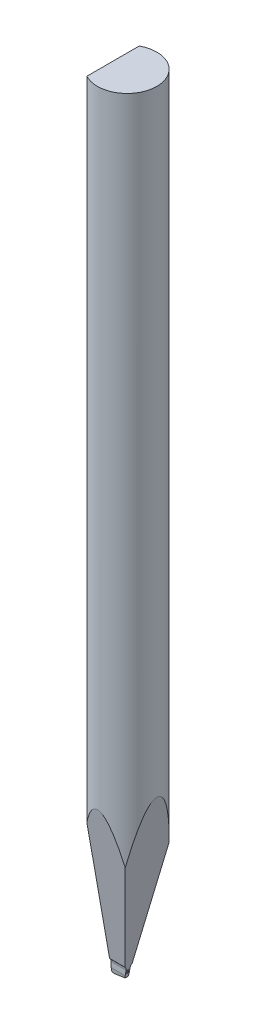
ISO-10303-21;
HEADER;
FILE_DESCRIPTION(('STEP AP214'),'2;1');
FILE_NAME('part.step','',(''),(''),'','','');
FILE_SCHEMA(('AUTOMOTIVE_DESIGN { 1 0 10303 214 1 1 1 1 }'));
ENDSEC;
DATA;
#1=APPLICATION_CONTEXT('core data for automotive mechanical design processes');
#2=APPLICATION_PROTOCOL_DEFINITION('international standard','automotive_design',2000,#1);
#3=PRODUCT_CONTEXT('',#1,'mechanical');
#4=PRODUCT('Part','Part','',(#3));
#5=PRODUCT_RELATED_PRODUCT_CATEGORY('part','',(#4));
#6=PRODUCT_DEFINITION_FORMATION('','',#4);
#7=PRODUCT_DEFINITION_CONTEXT('part definition',#1,'design');
#8=PRODUCT_DEFINITION('design','',#6,#7);
#9=PRODUCT_DEFINITION_SHAPE('','',#8);
#10=(LENGTH_UNIT() NAMED_UNIT(*) SI_UNIT(.MILLI.,.METRE.));
#11=(NAMED_UNIT(*) PLANE_ANGLE_UNIT() SI_UNIT($,.RADIAN.));
#12=(NAMED_UNIT(*) SI_UNIT($,.STERADIAN.) SOLID_ANGLE_UNIT());
#13=UNCERTAINTY_MEASURE_WITH_UNIT(LENGTH_MEASURE(1.E-05),#10,'distance_accuracy_value','');
#14=(GEOMETRIC_REPRESENTATION_CONTEXT(3) GLOBAL_UNCERTAINTY_ASSIGNED_CONTEXT((#13)) GLOBAL_UNIT_ASSIGNED_CONTEXT((#10,
#11,#12)) REPRESENTATION_CONTEXT('',''));
#15=CARTESIAN_POINT('',(0.,0.,0.));
#16=DIRECTION('',(0.,0.,1.));
#17=DIRECTION('',(1.,0.,0.));
#18=AXIS2_PLACEMENT_3D('',#15,#16,#17);
#19=CARTESIAN_POINT('',(-0.29972,0.,26.5186797019495));
#20=DIRECTION('',(-0.173648177666931,0.984807753012208,0.));
#21=DIRECTION('',(-0.984807753012208,-0.173648177666931,0.));
#22=AXIS2_PLACEMENT_3D('',#19,#20,#21);
#23=PLANE('',#22);
#24=DIRECTION('',(-0.984807753012208,-0.173648177666931,0.));
#25=VECTOR('',#24,1.);
#26=CARTESIAN_POINT('',(-0.29972,0.,0.0190499999999996));
#27=LINE('',#26,#25);
#28=CARTESIAN_POINT('',(-0.1397,0.0282158434529687,0.0190499999999998));
#29=VERTEX_POINT('',#28);
#30=CARTESIAN_POINT('',(-0.286429626386857,0.00234345145169317,0.01905));
#31=VERTEX_POINT('',#30);
#32=EDGE_CURVE('E220',#29,#31,#27,.T.);
#33=ORIENTED_EDGE('',*,*,#32,.F.);
#34=DIRECTION('',(0.,0.,1.));
#35=VECTOR('',#34,1.);
#36=CARTESIAN_POINT('',(-0.1397,0.0282158434529687,26.5186797019495));
#37=LINE('',#36,#35);
#38=CARTESIAN_POINT('',(-0.1397,0.0282158434529687,-0.0190499999999998));
#39=VERTEX_POINT('',#38);
#40=EDGE_CURVE('E11',#39,#29,#37,.T.);
#41=ORIENTED_EDGE('',*,*,#40,.F.);
#42=DIRECTION('',(-0.984807753012208,-0.173648177666931,0.));
#43=VECTOR('',#42,1.);
#44=CARTESIAN_POINT('',(-0.29972,0.,-0.0190499999999996));
#45=LINE('',#44,#43);
#46=CARTESIAN_POINT('',(-0.286429626386857,0.00234345145169317,-0.01905));
#47=VERTEX_POINT('',#46);
#48=EDGE_CURVE('E184',#39,#47,#45,.T.);
#49=ORIENTED_EDGE('',*,*,#48,.T.);
#50=CARTESIAN_POINT('',(-0.983960151536872,-0.12065,0.));
#51=DIRECTION('',(-0.173648177666931,0.984807753012208,0.));
#52=DIRECTION('',(-0.984807753012208,-0.173648177666931,0.));
#53=AXIS2_PLACEMENT_3D('',#50,#51,#52);
#54=ELLIPSE('',#53,0.716736574332053,0.12446);
#55=CARTESIAN_POINT('',(-0.299720000000004,0.,-0.0305196359577053));
#56=VERTEX_POINT('',#55);
#57=EDGE_CURVE('E262',#47,#56,#54,.T.);
#58=ORIENTED_EDGE('',*,*,#57,.T.);
#59=DIRECTION('',(0.984346441568213,0.173566836012845,-0.0306045161452665));
#60=VECTOR('',#59,1.);
#61=CARTESIAN_POINT('',(26.0298035813508,4.64260539659195,-0.849096592201888));
#62=LINE('',#61,#60);
#63=CARTESIAN_POINT('',(-0.0113543651851163,0.0508466417269895,-0.0394456348148853));
#64=VERTEX_POINT('',#63);
#65=EDGE_CURVE('E371',#56,#64,#62,.T.);
#66=ORIENTED_EDGE('',*,*,#65,.T.);
#67=DIRECTION('',(0.,0.,-1.));
#68=VECTOR('',#67,1.);
#69=CARTESIAN_POINT('',(-0.0113543651851151,0.0508466417269888,26.5186797019495));
#70=LINE('',#69,#68);
#71=CARTESIAN_POINT('',(-0.0113543651851163,0.0508466417269895,0.0394456348148853));
#72=VERTEX_POINT('',#71);
#73=EDGE_CURVE('E275',#72,#64,#70,.T.);
#74=ORIENTED_EDGE('',*,*,#73,.F.);
#75=DIRECTION('',(-0.984346441568213,-0.173566836012845,-0.0306045161452665));
#76=VECTOR('',#75,1.);
#77=CARTESIAN_POINT('',(26.0298035813508,4.64260539659195,0.849096592201888));
#78=LINE('',#77,#76);
#79=CARTESIAN_POINT('',(-0.299720000000002,0.,0.0305196359577053));
#80=VERTEX_POINT('',#79);
#81=EDGE_CURVE('E307',#72,#80,#78,.T.);
#82=ORIENTED_EDGE('',*,*,#81,.T.);
#83=EDGE_CURVE('E265',#80,#31,#54,.T.);
#84=ORIENTED_EDGE('',*,*,#83,.T.);
#85=EDGE_LOOP('',(#33,#41,#49,#58,#66,#74,#82,#84));
#86=FACE_BOUND('',#85,.T.);
#87=ADVANCED_FACE('F43',(#86),#23,.F.);
#88=CARTESIAN_POINT('',(26.8389469491216,-0.12065,0.));
#89=DIRECTION('',(-1.,0.,0.));
#90=DIRECTION('',(0.,0.,1.));
#91=AXIS2_PLACEMENT_3D('',#88,#89,#90);
#92=CYLINDRICAL_SURFACE('',#91,0.12446);
#93=DIRECTION('',(-1.,0.,0.));
#94=VECTOR('',#93,1.);
#95=CARTESIAN_POINT('',(26.8389469491216,0.00234345145169317,0.01905));
#96=LINE('',#95,#94);
#97=CARTESIAN_POINT('',(-0.301769962417407,0.00234345145169282,0.01905));
#98=VERTEX_POINT('',#97);
#99=EDGE_CURVE('E51',#31,#98,#96,.T.);
#100=ORIENTED_EDGE('',*,*,#99,.F.);
#101=ORIENTED_EDGE('',*,*,#83,.F.);
#102=CARTESIAN_POINT('',(-0.29972,0.,0.0305592719154106));
#103=DIRECTION('',(-1.,0.,0.));
#104=VECTOR('',#103,1.);
#105=LINE('',#102,#104);
#106=CARTESIAN_POINT('',(-0.347979999999999,0.,0.0305196359577053));
#107=VERTEX_POINT('',#106);
#108=EDGE_CURVE('E66',#80,#107,#105,.T.);
#109=ORIENTED_EDGE('',*,*,#108,.T.);
#110=CARTESIAN_POINT('',(-0.34798,0.,-0.0305592719154105));
#111=CARTESIAN_POINT('',(-0.348430814510365,-4.0790157401786E-07,-0.030560581386463));
#112=CARTESIAN_POINT('',(-0.348879913015498,1.08939864350477E-05,-0.0305162789202461));
#113=CARTESIAN_POINT('',(-0.349756979795945,5.32586660468888E-05,-0.0303484247483048));
#114=CARTESIAN_POINT('',(-0.350185131865885,8.40923596505527E-05,-0.0302257916828257));
#115=CARTESIAN_POINT('',(-0.351011762424045,0.000161841460247365,-0.0299134495677672));
#116=CARTESIAN_POINT('',(-0.351410362022562,0.000208686245204474,-0.0297240349657186));
#117=CARTESIAN_POINT('',(-0.352176540220128,0.000314247686217708,-0.0292915141713706));
#118=CARTESIAN_POINT('',(-0.352544019029949,0.000373000623512143,-0.0290482436791118));
#119=CARTESIAN_POINT('',(-0.353492609976714,0.000542464303570054,-0.0283352771344417));
#120=CARTESIAN_POINT('',(-0.354042823136011,0.000660718500816304,-0.0278264292093499));
#121=CARTESIAN_POINT('',(-0.355058485849617,0.000906480045085761,-0.0267326241717132));
#122=CARTESIAN_POINT('',(-0.355523692710971,0.00103401247561593,-0.0261474570746311));
#123=CARTESIAN_POINT('',(-0.356737267127974,0.00139509322037842,-0.024424665265501));
#124=CARTESIAN_POINT('',(-0.357402825120589,0.00162934905892421,-0.0232293596959535));
#125=CARTESIAN_POINT('',(-0.358560754617679,0.00207372872141576,-0.0207553925747807));
#126=CARTESIAN_POINT('',(-0.359052698197646,0.00228379206987497,-0.0194765341415885));
#127=CARTESIAN_POINT('',(-0.36030774701552,0.00284958434009851,-0.0156411550181883));
#128=CARTESIAN_POINT('',(-0.360888602450784,0.00315568845104849,-0.0130178775361172));
#129=CARTESIAN_POINT('',(-0.361706163735848,0.00360035199279706,-0.00770331230592785));
#130=CARTESIAN_POINT('',(-0.361941722221542,0.00373835258818556,-0.00501182791337141));
#131=CARTESIAN_POINT('',(-0.362122159422928,0.00384312710698266,0.000626307070904409));
#132=CARTESIAN_POINT('',(-0.362039043463169,0.00379341669557573,0.00357417277699146));
#133=CARTESIAN_POINT('',(-0.36150170314798,0.00348744188955353,0.00941520395438301));
#134=CARTESIAN_POINT('',(-0.361049465589899,0.0032322834184667,0.0123085776336631));
#135=CARTESIAN_POINT('',(-0.360101881253082,0.00276522394071858,0.0161243719322801));
#136=CARTESIAN_POINT('',(-0.359823561043634,0.00263206670724784,0.0171113029227183));
#137=CARTESIAN_POINT('',(-0.359191091592352,0.00234550293161942,0.0190622381461741));
#138=CARTESIAN_POINT('',(-0.358836664817193,0.00219202308727775,0.0200261437209395));
#139=CARTESIAN_POINT('',(-0.35792019094462,0.00182196264863964,0.0221910750494741));
#140=CARTESIAN_POINT('',(-0.35732773854375,0.00160009037378041,0.0233785738678838));
#141=CARTESIAN_POINT('',(-0.355941185679961,0.00114822728257018,0.0256274014231926));
#142=CARTESIAN_POINT('',(-0.35514861217987,0.000918308819136108,0.0266895999907303));
#143=CARTESIAN_POINT('',(-0.353869594547934,0.000625501592054897,0.027976474269296));
#144=CARTESIAN_POINT('',(-0.353498623594593,0.000547541257563668,0.0283116735867265));
#145=CARTESIAN_POINT('',(-0.352713845163361,0.000401035258663639,0.0289316105181223));
#146=CARTESIAN_POINT('',(-0.352300015965373,0.000332494409296592,0.0292163223453788));
#147=CARTESIAN_POINT('',(-0.35142414885153,0.000209524327572587,0.0297209697927657));
#148=CARTESIAN_POINT('',(-0.350961529273433,0.000155300800887052,0.0299399667559707));
#149=CARTESIAN_POINT('',(-0.350001496573154,6.91140443385488E-05,0.030285638001186));
#150=CARTESIAN_POINT('',(-0.349504228801302,3.70633361955864E-05,0.0304126751846489));
#151=CARTESIAN_POINT('',(-0.348830789757912,1.24370193427594E-05,0.0305101337557273));
#152=CARTESIAN_POINT('',(-0.348661251457123,7.78649892713723E-06,0.0305285162109277));
#153=CARTESIAN_POINT('',(-0.348321176485651,1.56788977353475E-06,0.0305530840375707));
#154=CARTESIAN_POINT('',(-0.348150639475355,9.18970805127776E-10,0.0305592649853819));
#155=CARTESIAN_POINT('',(-0.347980000000024,0.,0.0305592719155779));
#156=B_SPLINE_CURVE_WITH_KNOTS('',3,(#110,#111,#112,#113,#114,#115,#116,#117,#118,#119,#120,
#121,#122,#123,#124,#125,#126,#127,#128,#129,#130,#131,#132,#133,#134,#135,#136,#137,#138,#139,
#140,#141,#142,#143,#144,#145,#146,#147,#148,#149,#150,#151,#152,#153,#154,#155),.UNSPECIFIED.,
.F.,.F.,(4,2,2,2,2,2,2,2,2,2,2,2,2,2,2,2,2,2,2,2,2,2,4),(0.,0.00134741004079565,
0.00267930111383719,0.00400539168870872,0.00533558497102969,0.00759858100656418,
0.00986794025135302,0.0140085166125864,0.0181592285296514,0.0262271883927134,0.0343218964425103,
0.0431433167180924,0.0519175663828487,0.0550173321670425,0.0581285996977776,0.0621538633051677,
0.0661492954960546,0.0676639727026794,0.0691794213229861,0.0707155853403851,0.0722456536356855,
0.0727570681004673,0.0732686679434896),.UNSPECIFIED.);
#157=CARTESIAN_POINT('',(-0.347980000000002,0.,-0.030519635957705));
#158=VERTEX_POINT('',#157);
#159=EDGE_CURVE('E260',#158,#107,#156,.T.);
#160=ORIENTED_EDGE('',*,*,#159,.F.);
#161=CARTESIAN_POINT('',(-0.299720000000007,0.,-0.0304799999999999));
#162=DIRECTION('',(-1.,0.,0.));
#163=VECTOR('',#162,1.);
#164=LINE('',#161,#163);
#165=EDGE_CURVE('E331',#56,#158,#164,.T.);
#166=ORIENTED_EDGE('',*,*,#165,.F.);
#167=ORIENTED_EDGE('',*,*,#57,.F.);
#168=DIRECTION('',(-1.,0.,0.));
#169=VECTOR('',#168,1.);
#170=CARTESIAN_POINT('',(26.8389469491216,0.00234345145169317,-0.01905));
#171=LINE('',#170,#169);
#172=CARTESIAN_POINT('',(-0.301769962417407,0.00234345145169364,-0.01905));
#173=VERTEX_POINT('',#172);
#174=EDGE_CURVE('E266',#47,#173,#171,.T.);
#175=ORIENTED_EDGE('',*,*,#174,.T.);
#176=CARTESIAN_POINT('',(-0.301769962417407,0.00234345145169314,-0.01905));
#177=CARTESIAN_POINT('',(-0.303083212357795,0.00234273884135903,-0.0190505532683335));
#178=CARTESIAN_POINT('',(-0.304398530056794,0.00235919648592935,-0.0189481276282325));
#179=CARTESIAN_POINT('',(-0.307000954094572,0.00242318594032791,-0.0185302442706134));
#180=CARTESIAN_POINT('',(-0.308287873692993,0.00247088218091991,-0.0182136589885027));
#181=CARTESIAN_POINT('',(-0.310790852582439,0.00259423811870583,-0.0173587153989119));
#182=CARTESIAN_POINT('',(-0.312006641691863,0.00266999731654825,-0.0168195671794881));
#183=CARTESIAN_POINT('',(-0.314311894657055,0.00283986679158173,-0.015523243690556));
#184=CARTESIAN_POINT('',(-0.315401659849181,0.00293393178806268,-0.0147666042420507));
#185=CARTESIAN_POINT('',(-0.31730332104955,0.00311685645192294,-0.0131397171256992));
#186=CARTESIAN_POINT('',(-0.318132319467869,0.00320524260215012,-0.0122894206437063));
#187=CARTESIAN_POINT('',(-0.3196165652278,0.00337418177810725,-0.0104472759959153));
#188=CARTESIAN_POINT('',(-0.320271844381019,0.00345473623626944,-0.00945545379765719));
#189=CARTESIAN_POINT('',(-0.3213234426909,0.00358935319513246,-0.00746762605607109));
#190=CARTESIAN_POINT('',(-0.32173909228563,0.00364525831027112,-0.00648193686690554));
#191=CARTESIAN_POINT('',(-0.322389726393463,0.00373449435681656,-0.0044518189481206));
#192=CARTESIAN_POINT('',(-0.322624798676981,0.00376783625423748,-0.00340741902037943));
#193=CARTESIAN_POINT('',(-0.322897837996913,0.00380671319708877,-0.00134948273672548));
#194=CARTESIAN_POINT('',(-0.322945634936013,0.00381363450040313,-0.000337264641997512));
#195=CARTESIAN_POINT('',(-0.322869697716228,0.00380274111245844,0.00168052629893266));
#196=CARTESIAN_POINT('',(-0.322745983850237,0.00378492934757725,0.00268609991715538));
#197=CARTESIAN_POINT('',(-0.322334355344498,0.00372702254235129,0.0046473278957709));
#198=CARTESIAN_POINT('',(-0.322048793640665,0.00368724701865936,0.00560348787902325));
#199=CARTESIAN_POINT('',(-0.321324937242233,0.00358998817113897,0.00745501684823445));
#200=CARTESIAN_POINT('',(-0.320886639683836,0.00353250451528526,0.00835038469396416));
#201=CARTESIAN_POINT('',(-0.319862680839835,0.00340476764403495,0.0100730618825254));
#202=CARTESIAN_POINT('',(-0.319274533821476,0.00333430521919907,0.0108988749361181));
#203=CARTESIAN_POINT('',(-0.317974173980919,0.00318863460274331,0.0124454369952645));
#204=CARTESIAN_POINT('',(-0.317261944798882,0.00311342578616174,0.0131661721235828));
#205=CARTESIAN_POINT('',(-0.31569583062112,0.00296171888527247,0.0145232749481605));
#206=CARTESIAN_POINT('',(-0.314836555870207,0.00288535232362802,0.0151534243532859));
#207=CARTESIAN_POINT('',(-0.313030647680624,0.00274271134593144,0.0162742350252514));
#208=CARTESIAN_POINT('',(-0.312083969657596,0.00267644212671652,0.0167648245761543));
#209=CARTESIAN_POINT('',(-0.31004264333725,0.00255444746912226,0.0176399463518506));
#210=CARTESIAN_POINT('',(-0.308942302803632,0.00250016076595805,0.0180113663892418));
#211=CARTESIAN_POINT('',(-0.306698785837096,0.00241476087320615,0.0185861575843008));
#212=CARTESIAN_POINT('',(-0.305555627526932,0.00238363799331208,0.0187895990176943));
#213=CARTESIAN_POINT('',(-0.30352895790095,0.00235048998193052,0.0190043678177182));
#214=CARTESIAN_POINT('',(-0.302649080375743,0.00234326902739348,0.0190501179681685));
#215=CARTESIAN_POINT('',(-0.301769962417412,0.00234345145168755,0.0190500000000401));
#216=B_SPLINE_CURVE_WITH_KNOTS('',3,(#176,#177,#178,#179,#180,#181,#182,#183,#184,#185,#186,
#187,#188,#189,#190,#191,#192,#193,#194,#195,#196,#197,#198,#199,#200,#201,#202,#203,#204,#205,
#206,#207,#208,#209,#210,#211,#212,#213,#214,#215),.UNSPECIFIED.,.F.,.F.,(4,2,2,2,2,2,2,2,2,2,2,
2,2,2,2,2,2,2,2,4),(0.,0.0039388640861778,0.00789862964445358,0.0118725715602336,
0.0158368057995756,0.0193894604666261,0.0229414641187126,0.0261386218593387,0.0293342246220546,
0.0323596502009959,0.0353847178468262,0.0383668955619843,0.0413491291960031,0.0443844811882459,
0.0474202336852696,0.0506115954385173,0.0538045941937902,0.0572782451267952,0.0607504420817328,
0.063388074501748),.UNSPECIFIED.);
#217=EDGE_CURVE('E423',#173,#98,#216,.T.);
#218=ORIENTED_EDGE('',*,*,#217,.T.);
#219=EDGE_LOOP('',(#100,#101,#109,#160,#166,#167,#175,#218));
#220=FACE_BOUND('',#219,.T.);
#221=ADVANCED_FACE('F230',(#220),#92,.F.);
#222=CARTESIAN_POINT('',(26.8738719491216,0.,0.03048));
#223=DIRECTION('',(0.,-0.173648177666931,0.984807753012208));
#224=DIRECTION('',(0.,-0.984807753012208,-0.173648177666931));
#225=AXIS2_PLACEMENT_3D('',#222,#223,#224);
#226=PLANE('',#225);
#227=CARTESIAN_POINT('',(-0.34798,0.02794,0.0354065758409947));
#228=DIRECTION('',(0.,-0.173648177666931,0.984807753012208));
#229=DIRECTION('',(0.,-0.984807753012208,-0.173648177666931));
#230=AXIS2_PLACEMENT_3D('',#227,#228,#229);
#231=ELLIPSE('',#230,0.0283710195360877,0.02794);
#232=CARTESIAN_POINT('',(-0.37592,0.02794,0.0354065758409947));
#233=VERTEX_POINT('',#232);
#234=EDGE_CURVE('E274',#107,#233,#231,.F.);
#235=ORIENTED_EDGE('',*,*,#234,.F.);
#236=ORIENTED_EDGE('',*,*,#108,.F.);
#237=ORIENTED_EDGE('',*,*,#81,.F.);
#238=DIRECTION('',(-0.171087869746036,-0.970287525247814,-0.171087869746036));
#239=VECTOR('',#238,1.);
#240=CARTESIAN_POINT('',(0.766901483986011,4.46455489014234,0.817701483986016));
#241=LINE('',#240,#239);
#242=CARTESIAN_POINT('',(0.,0.115240446574631,0.0508));
#243=VERTEX_POINT('',#242);
#244=EDGE_CURVE('E292',#243,#72,#241,.T.);
#245=ORIENTED_EDGE('',*,*,#244,.F.);
#246=DIRECTION('',(-1.,0.,0.));
#247=VECTOR('',#246,1.);
#248=CARTESIAN_POINT('',(26.8738719491216,0.115240446574631,0.0508));
#249=LINE('',#248,#247);
#250=CARTESIAN_POINT('',(-0.375919999999998,0.115240446574631,0.0508));
#251=VERTEX_POINT('',#250);
#252=EDGE_CURVE('E359',#243,#251,#249,.T.);
#253=ORIENTED_EDGE('',*,*,#252,.T.);
#254=DIRECTION('',(0.,0.984807753012208,0.173648177666931));
#255=VECTOR('',#254,1.);
#256=CARTESIAN_POINT('',(-0.37592,20.2128607163583,3.59455270159622));
#257=LINE('',#256,#255);
#258=EDGE_CURVE('E345',#233,#251,#257,.T.);
#259=ORIENTED_EDGE('',*,*,#258,.F.);
#260=EDGE_LOOP('',(#235,#236,#237,#245,#253,#259));
#261=FACE_BOUND('',#260,.T.);
#262=ADVANCED_FACE('F240',(#261),#226,.T.);
#263=CARTESIAN_POINT('',(26.8738719491216,0.,-0.03048));
#264=DIRECTION('',(0.,-0.173648177666931,-0.984807753012208));
#265=DIRECTION('',(0.,0.984807753012208,-0.173648177666931));
#266=AXIS2_PLACEMENT_3D('',#263,#264,#265);
#267=PLANE('',#266);
#268=CARTESIAN_POINT('',(-0.34798,0.02794,-0.0354065758409947));
#269=DIRECTION('',(0.,-0.173648177666931,-0.984807753012208));
#270=DIRECTION('',(0.,0.984807753012208,-0.173648177666931));
#271=AXIS2_PLACEMENT_3D('',#268,#269,#270);
#272=ELLIPSE('',#271,0.0283710195360877,0.02794);
#273=CARTESIAN_POINT('',(-0.37592,0.02794,-0.0354065758409947));
#274=VERTEX_POINT('',#273);
#275=EDGE_CURVE('E415',#274,#158,#272,.F.);
#276=ORIENTED_EDGE('',*,*,#275,.F.);
#277=DIRECTION('',(0.,-0.984807753012208,0.173648177666931));
#278=VECTOR('',#277,1.);
#279=CARTESIAN_POINT('',(-0.37592,20.5707779559457,-3.65766316779618));
#280=LINE('',#279,#278);
#281=CARTESIAN_POINT('',(-0.375919999999998,0.115240446574631,-0.0508));
#282=VERTEX_POINT('',#281);
#283=EDGE_CURVE('E347',#282,#274,#280,.T.);
#284=ORIENTED_EDGE('',*,*,#283,.F.);
#285=DIRECTION('',(1.,0.,0.));
#286=VECTOR('',#285,1.);
#287=CARTESIAN_POINT('',(26.8738719491216,0.115240446574631,-0.0508));
#288=LINE('',#287,#286);
#289=CARTESIAN_POINT('',(0.,0.115240446574631,-0.0508));
#290=VERTEX_POINT('',#289);
#291=EDGE_CURVE('E351',#282,#290,#288,.T.);
#292=ORIENTED_EDGE('',*,*,#291,.T.);
#293=DIRECTION('',(0.171087869746036,0.970287525247814,-0.171087869746036));
#294=VECTOR('',#293,1.);
#295=CARTESIAN_POINT('',(0.766901483986011,4.46455489014234,-0.817701483986016));
#296=LINE('',#295,#294);
#297=EDGE_CURVE('E304',#64,#290,#296,.T.);
#298=ORIENTED_EDGE('',*,*,#297,.F.);
#299=ORIENTED_EDGE('',*,*,#65,.F.);
#300=ORIENTED_EDGE('',*,*,#165,.T.);
#301=EDGE_LOOP('',(#276,#284,#292,#298,#299,#300));
#302=FACE_BOUND('',#301,.T.);
#303=ADVANCED_FACE('F390',(#302),#267,.T.);
#304=CARTESIAN_POINT('',(0.,21.0312,0.));
#305=DIRECTION('',(0.,-1.,0.));
#306=DIRECTION('',(0.,0.,-1.));
#307=AXIS2_PLACEMENT_3D('',#304,#305,#306);
#308=CYLINDRICAL_SURFACE('',#307,0.792479999999998);
#309=CARTESIAN_POINT('',(0.,-0.172860669861948,0.));
#310=DIRECTION('',(0.,-0.173648177666931,0.984807753012208));
#311=DIRECTION('',(0.,-0.984807753012208,-0.173648177666931));
#312=AXIS2_PLACEMENT_3D('',#309,#310,#311);
#313=ELLIPSE('',#312,4.56371043248163,0.792479999999998);
#314=CARTESIAN_POINT('',(0.534392028524877,3.1459282424964,0.585192028524881));
#315=VERTEX_POINT('',#314);
#316=CARTESIAN_POINT('',(-0.37592,3.78368137728878,0.69764511322018));
#317=VERTEX_POINT('',#316);
#318=EDGE_CURVE('E328',#315,#317,#313,.T.);
#319=ORIENTED_EDGE('',*,*,#318,.F.);
#320=CARTESIAN_POINT('',(0.,0.115240446574631,0.));
#321=DIRECTION('',(-0.984807753012208,0.173648177666931,0.));
#322=DIRECTION('',(-0.173648177666931,-0.984807753012208,0.));
#323=AXIS2_PLACEMENT_3D('',#320,#321,#322);
#324=ELLIPSE('',#323,4.56371043248165,0.792479999999998);
#325=CARTESIAN_POINT('',(0.534392028524877,3.1459282424964,-0.585192028524881));
#326=VERTEX_POINT('',#325);
#327=EDGE_CURVE('E284',#315,#326,#324,.T.);
#328=ORIENTED_EDGE('',*,*,#327,.T.);
#329=CARTESIAN_POINT('',(0.,-0.172860669861948,0.));
#330=DIRECTION('',(0.,-0.173648177666931,-0.984807753012208));
#331=DIRECTION('',(0.,-0.984807753012208,0.173648177666931));
#332=AXIS2_PLACEMENT_3D('',#329,#330,#331);
#333=ELLIPSE('',#332,4.56371043248163,0.792479999999998);
#334=CARTESIAN_POINT('',(-0.37592,3.78368137728877,-0.69764511322018));
#335=VERTEX_POINT('',#334);
#336=EDGE_CURVE('E330',#335,#326,#333,.T.);
#337=ORIENTED_EDGE('',*,*,#336,.F.);
#338=DIRECTION('',(0.,-1.,0.));
#339=VECTOR('',#338,1.);
#340=CARTESIAN_POINT('',(-0.37592,21.0312,-0.69764511322018));
#341=LINE('',#340,#339);
#342=CARTESIAN_POINT('',(-0.37592,21.0312,-0.69764511322018));
#343=VERTEX_POINT('',#342);
#344=EDGE_CURVE('E338',#343,#335,#341,.T.);
#345=ORIENTED_EDGE('',*,*,#344,.F.);
#346=CARTESIAN_POINT('',(0.,21.0312,0.));
#347=DIRECTION('',(0.,1.,0.));
#348=DIRECTION('',(0.,0.,1.));
#349=AXIS2_PLACEMENT_3D('',#346,#347,#348);
#350=CIRCLE('',#349,0.792479999999998);
#351=CARTESIAN_POINT('',(-0.37592,21.0312,0.69764511322018));
#352=VERTEX_POINT('',#351);
#353=EDGE_CURVE('E341',#352,#343,#350,.T.);
#354=ORIENTED_EDGE('',*,*,#353,.F.);
#355=DIRECTION('',(0.,-1.,0.));
#356=VECTOR('',#355,1.);
#357=CARTESIAN_POINT('',(-0.37592,21.0312,0.69764511322018));
#358=LINE('',#357,#356);
#359=EDGE_CURVE('E336',#317,#352,#358,.F.);
#360=ORIENTED_EDGE('',*,*,#359,.F.);
#361=EDGE_LOOP('',(#319,#328,#337,#345,#354,#360));
#362=FACE_BOUND('',#361,.T.);
#363=ADVANCED_FACE('F45',(#362),#308,.T.);
#364=CARTESIAN_POINT('',(-0.37592,21.0312,-1.04648));
#365=DIRECTION('',(-1.,0.,0.));
#366=DIRECTION('',(0.,0.,1.));
#367=AXIS2_PLACEMENT_3D('',#364,#365,#366);
#368=PLANE('',#367);
#369=DIRECTION('',(0.,0.,-1.));
#370=VECTOR('',#369,1.);
#371=CARTESIAN_POINT('',(-0.37592,0.02794,26.4420719491216));
#372=LINE('',#371,#370);
#373=EDGE_CURVE('E270',#233,#274,#372,.T.);
#374=ORIENTED_EDGE('',*,*,#373,.F.);
#375=ORIENTED_EDGE('',*,*,#258,.T.);
#376=DIRECTION('',(0.,1.,0.));
#377=VECTOR('',#376,1.);
#378=CARTESIAN_POINT('',(-0.37592,21.0312,0.0507999999999999));
#379=LINE('',#378,#377);
#380=CARTESIAN_POINT('',(-0.375919999999998,0.254,0.0508));
#381=VERTEX_POINT('',#380);
#382=EDGE_CURVE('E325',#251,#381,#379,.T.);
#383=ORIENTED_EDGE('',*,*,#382,.T.);
#384=CARTESIAN_POINT('',(-0.375919999999998,0.254,0.1778));
#385=DIRECTION('',(-1.,0.,0.));
#386=DIRECTION('',(0.,0.,1.));
#387=AXIS2_PLACEMENT_3D('',#384,#385,#386);
#388=CIRCLE('',#387,0.127);
#389=CARTESIAN_POINT('',(-0.375919999999998,0.343802561210692,0.0879974387893087));
#390=VERTEX_POINT('',#389);
#391=EDGE_CURVE('E362',#381,#390,#388,.F.);
#392=ORIENTED_EDGE('',*,*,#391,.T.);
#393=DIRECTION('',(0.,0.707106781186546,0.707106781186549));
#394=VECTOR('',#393,1.);
#395=CARTESIAN_POINT('',(-0.37592,10.1202625612106,9.86445743878931));
#396=LINE('',#395,#394);
#397=CARTESIAN_POINT('',(-0.375919999999998,0.347571324683702,0.0917662022623191));
#398=VERTEX_POINT('',#397);
#399=EDGE_CURVE('E322',#390,#398,#396,.T.);
#400=ORIENTED_EDGE('',*,*,#399,.T.);
#401=EDGE_CURVE('E344',#398,#317,#257,.T.);
#402=ORIENTED_EDGE('',*,*,#401,.T.);
#403=ORIENTED_EDGE('',*,*,#359,.T.);
#404=DIRECTION('',(0.,0.,-1.));
#405=VECTOR('',#404,1.);
#406=CARTESIAN_POINT('',(-0.37592,21.0312,-1.04648));
#407=LINE('',#406,#405);
#408=EDGE_CURVE('E334',#352,#343,#407,.T.);
#409=ORIENTED_EDGE('',*,*,#408,.T.);
#410=ORIENTED_EDGE('',*,*,#344,.T.);
#411=CARTESIAN_POINT('',(-0.375919999999998,0.347571324683702,-0.0917662022623191));
#412=VERTEX_POINT('',#411);
#413=EDGE_CURVE('E348',#335,#412,#280,.T.);
#414=ORIENTED_EDGE('',*,*,#413,.T.);
#415=DIRECTION('',(0.,-0.707106781186546,0.707106781186549));
#416=VECTOR('',#415,1.);
#417=CARTESIAN_POINT('',(-0.37592,11.1667425612106,-10.9109374387893));
#418=LINE('',#417,#416);
#419=CARTESIAN_POINT('',(-0.375919999999998,0.343802561210692,-0.0879974387893087));
#420=VERTEX_POINT('',#419);
#421=EDGE_CURVE('E319',#412,#420,#418,.T.);
#422=ORIENTED_EDGE('',*,*,#421,.T.);
#423=CARTESIAN_POINT('',(-0.375919999999998,0.254,-0.1778));
#424=DIRECTION('',(-1.,0.,0.));
#425=DIRECTION('',(0.,0.,1.));
#426=AXIS2_PLACEMENT_3D('',#423,#424,#425);
#427=CIRCLE('',#426,0.127);
#428=CARTESIAN_POINT('',(-0.375919999999998,0.254,-0.0508));
#429=VERTEX_POINT('',#428);
#430=EDGE_CURVE('E365',#420,#429,#427,.F.);
#431=ORIENTED_EDGE('',*,*,#430,.T.);
#432=DIRECTION('',(0.,-1.,0.));
#433=VECTOR('',#432,1.);
#434=CARTESIAN_POINT('',(-0.37592,21.0312,-0.0507999999999999));
#435=LINE('',#434,#433);
#436=EDGE_CURVE('E316',#429,#282,#435,.T.);
#437=ORIENTED_EDGE('',*,*,#436,.T.);
#438=ORIENTED_EDGE('',*,*,#283,.T.);
#439=EDGE_LOOP('',(#374,#375,#383,#392,#400,#402,#403,#409,#410,#414,#422,#431,#437,#438));
#440=FACE_BOUND('',#439,.T.);
#441=ADVANCED_FACE('F400',(#440),#368,.T.);
#442=DIRECTION('',(-0.171087869746036,-0.970287525247814,-0.171087869746036));
#443=VECTOR('',#442,1.);
#444=CARTESIAN_POINT('',(0.766901483986011,4.46455489014234,0.817701483986016));
#445=LINE('',#444,#443);
#446=CARTESIAN_POINT('',(0.0409662022623215,0.347571324683702,0.091766202262319));
#447=VERTEX_POINT('',#446);
#448=EDGE_CURVE('E281',#315,#447,#445,.T.);
#449=ORIENTED_EDGE('',*,*,#448,.F.);
#450=ORIENTED_EDGE('',*,*,#318,.T.);
#451=ORIENTED_EDGE('',*,*,#401,.F.);
#452=DIRECTION('',(1.,0.,0.));
#453=VECTOR('',#452,1.);
#454=CARTESIAN_POINT('',(26.8738719491216,0.347571324683702,0.0917662022623191));
#455=LINE('',#454,#453);
#456=EDGE_CURVE('E356',#398,#447,#455,.T.);
#457=ORIENTED_EDGE('',*,*,#456,.T.);
#458=EDGE_LOOP('',(#449,#450,#451,#457));
#459=FACE_BOUND('',#458,.T.);
#460=ADVANCED_FACE('F391',(#459),#226,.T.);
#461=DIRECTION('',(0.171087869746036,0.970287525247814,-0.171087869746036));
#462=VECTOR('',#461,1.);
#463=CARTESIAN_POINT('',(0.766901483986011,4.46455489014234,-0.817701483986016));
#464=LINE('',#463,#462);
#465=CARTESIAN_POINT('',(0.0409662022623215,0.347571324683702,-0.091766202262319));
#466=VERTEX_POINT('',#465);
#467=EDGE_CURVE('E289',#466,#326,#464,.T.);
#468=ORIENTED_EDGE('',*,*,#467,.F.);
#469=DIRECTION('',(-1.,0.,0.));
#470=VECTOR('',#469,1.);
#471=CARTESIAN_POINT('',(26.8738719491216,0.347571324683702,-0.0917662022623191));
#472=LINE('',#471,#470);
#473=EDGE_CURVE('E354',#466,#412,#472,.T.);
#474=ORIENTED_EDGE('',*,*,#473,.T.);
#475=ORIENTED_EDGE('',*,*,#413,.F.);
#476=ORIENTED_EDGE('',*,*,#336,.T.);
#477=EDGE_LOOP('',(#468,#474,#475,#476));
#478=FACE_BOUND('',#477,.T.);
#479=ADVANCED_FACE('F394',(#478),#267,.T.);
#480=CARTESIAN_POINT('',(0.,21.0312,0.));
#481=DIRECTION('',(0.,1.,0.));
#482=DIRECTION('',(0.,0.,1.));
#483=AXIS2_PLACEMENT_3D('',#480,#481,#482);
#484=PLANE('',#483);
#485=ORIENTED_EDGE('',*,*,#353,.T.);
#486=ORIENTED_EDGE('',*,*,#408,.F.);
#487=EDGE_LOOP('',(#485,#486));
#488=FACE_BOUND('',#487,.T.);
#489=ADVANCED_FACE('F398',(#488),#484,.T.);
#490=CARTESIAN_POINT('',(26.8738719491216,0.,-0.0508));
#491=DIRECTION('',(0.,0.,-1.));
#492=DIRECTION('',(-1.,0.,0.));
#493=AXIS2_PLACEMENT_3D('',#490,#491,#492);
#494=PLANE('',#493);
#495=DIRECTION('',(0.173648177666931,0.984807753012208,0.));
#496=VECTOR('',#495,1.);
#497=CARTESIAN_POINT('',(0.790639116266124,4.59917769253331,-0.0508));
#498=LINE('',#497,#496);
#499=CARTESIAN_POINT('',(0.0244670530999483,0.254,-0.0508));
#500=VERTEX_POINT('',#499);
#501=EDGE_CURVE('E301',#290,#500,#498,.T.);
#502=ORIENTED_EDGE('',*,*,#501,.F.);
#503=ORIENTED_EDGE('',*,*,#291,.F.);
#504=ORIENTED_EDGE('',*,*,#436,.F.);
#505=DIRECTION('',(-1.,0.,0.));
#506=VECTOR('',#505,1.);
#507=CARTESIAN_POINT('',(26.8738719491216,0.254,-0.0508));
#508=LINE('',#507,#506);
#509=EDGE_CURVE('E312',#500,#429,#508,.T.);
#510=ORIENTED_EDGE('',*,*,#509,.F.);
#511=EDGE_LOOP('',(#502,#503,#504,#510));
#512=FACE_BOUND('',#511,.T.);
#513=ADVANCED_FACE('F452',(#512),#494,.T.);
#514=CARTESIAN_POINT('',(26.8738719491216,0.343802561210692,-0.0879974387893087));
#515=DIRECTION('',(0.,-0.707106781186549,-0.707106781186546));
#516=DIRECTION('',(0.,0.707106781186546,-0.707106781186549));
#517=AXIS2_PLACEMENT_3D('',#514,#515,#516);
#518=PLANE('',#517);
#519=DIRECTION('',(0.123724030206484,0.701673843159862,-0.701673843159865));
#520=VECTOR('',#519,1.);
#521=CARTESIAN_POINT('',(0.451060184651006,2.67332987133929,-2.41752474891792));
#522=LINE('',#521,#520);
#523=CARTESIAN_POINT('',(0.0403016675781138,0.343802561210692,-0.0879974387893087));
#524=VERTEX_POINT('',#523);
#525=EDGE_CURVE('E295',#524,#466,#522,.T.);
#526=ORIENTED_EDGE('',*,*,#525,.F.);
#527=DIRECTION('',(-1.,0.,0.));
#528=VECTOR('',#527,1.);
#529=CARTESIAN_POINT('',(26.8738719491216,0.343802561210692,-0.0879974387893087));
#530=LINE('',#529,#528);
#531=EDGE_CURVE('E314',#524,#420,#530,.T.);
#532=ORIENTED_EDGE('',*,*,#531,.T.);
#533=ORIENTED_EDGE('',*,*,#421,.F.);
#534=ORIENTED_EDGE('',*,*,#473,.F.);
#535=EDGE_LOOP('',(#526,#532,#533,#534));
#536=FACE_BOUND('',#535,.T.);
#537=ADVANCED_FACE('F392',(#536),#518,.T.);
#538=CARTESIAN_POINT('',(26.8738719491216,0.254,-0.1778));
#539=DIRECTION('',(-1.,0.,0.));
#540=DIRECTION('',(0.,0.,1.));
#541=AXIS2_PLACEMENT_3D('',#538,#539,#540);
#542=CYLINDRICAL_SURFACE('',#541,0.127);
#543=CARTESIAN_POINT('',(0.0244670530999483,0.254,-0.1778));
#544=DIRECTION('',(-0.984807753012208,0.173648177666931,0.));
#545=DIRECTION('',(-0.173648177666931,-0.984807753012208,0.));
#546=AXIS2_PLACEMENT_3D('',#543,#544,#545);
#547=ELLIPSE('',#546,0.12895917970949,0.127);
#548=EDGE_CURVE('E298',#500,#524,#547,.T.);
#549=ORIENTED_EDGE('',*,*,#548,.F.);
#550=ORIENTED_EDGE('',*,*,#509,.T.);
#551=ORIENTED_EDGE('',*,*,#430,.F.);
#552=ORIENTED_EDGE('',*,*,#531,.F.);
#553=EDGE_LOOP('',(#549,#550,#551,#552));
#554=FACE_BOUND('',#553,.T.);
#555=ADVANCED_FACE('F459',(#554),#542,.F.);
#556=CARTESIAN_POINT('',(26.8738719491216,0.254,0.1778));
#557=DIRECTION('',(-1.,0.,0.));
#558=DIRECTION('',(0.,0.,1.));
#559=AXIS2_PLACEMENT_3D('',#556,#557,#558);
#560=CYLINDRICAL_SURFACE('',#559,0.127);
#561=CARTESIAN_POINT('',(0.0244670530999483,0.254,0.1778));
#562=DIRECTION('',(-0.984807753012208,0.173648177666931,0.));
#563=DIRECTION('',(-0.173648177666931,-0.984807753012208,0.));
#564=AXIS2_PLACEMENT_3D('',#561,#562,#563);
#565=ELLIPSE('',#564,0.12895917970949,0.127);
#566=CARTESIAN_POINT('',(0.040301667578118,0.343802561210692,0.087997438789309));
#567=VERTEX_POINT('',#566);
#568=CARTESIAN_POINT('',(0.0244670530999523,0.254,0.0508));
#569=VERTEX_POINT('',#568);
#570=EDGE_CURVE('E278',#567,#569,#565,.T.);
#571=ORIENTED_EDGE('',*,*,#570,.F.);
#572=DIRECTION('',(-1.,0.,0.));
#573=VECTOR('',#572,1.);
#574=CARTESIAN_POINT('',(26.8738719491216,0.343802561210692,0.0879974387893087));
#575=LINE('',#574,#573);
#576=EDGE_CURVE('E308',#567,#390,#575,.T.);
#577=ORIENTED_EDGE('',*,*,#576,.T.);
#578=ORIENTED_EDGE('',*,*,#391,.F.);
#579=DIRECTION('',(-1.,0.,0.));
#580=VECTOR('',#579,1.);
#581=CARTESIAN_POINT('',(26.8738719491216,0.254,0.0508));
#582=LINE('',#581,#580);
#583=EDGE_CURVE('E310',#569,#381,#582,.T.);
#584=ORIENTED_EDGE('',*,*,#583,.F.);
#585=EDGE_LOOP('',(#571,#577,#578,#584));
#586=FACE_BOUND('',#585,.T.);
#587=ADVANCED_FACE('F481',(#586),#560,.F.);
#588=CARTESIAN_POINT('',(26.8738719491216,0.,0.0508));
#589=DIRECTION('',(0.,0.,1.));
#590=DIRECTION('',(1.,0.,0.));
#591=AXIS2_PLACEMENT_3D('',#588,#589,#590);
#592=PLANE('',#591);
#593=DIRECTION('',(-0.173648177666931,-0.984807753012208,0.));
#594=VECTOR('',#593,1.);
#595=CARTESIAN_POINT('',(0.790639116266124,4.59917769253331,0.0508));
#596=LINE('',#595,#594);
#597=EDGE_CURVE('E286',#569,#243,#596,.T.);
#598=ORIENTED_EDGE('',*,*,#597,.F.);
#599=ORIENTED_EDGE('',*,*,#583,.T.);
#600=ORIENTED_EDGE('',*,*,#382,.F.);
#601=ORIENTED_EDGE('',*,*,#252,.F.);
#602=EDGE_LOOP('',(#598,#599,#600,#601));
#603=FACE_BOUND('',#602,.T.);
#604=ADVANCED_FACE('F484',(#603),#592,.T.);
#605=CARTESIAN_POINT('',(26.8738719491216,0.343802561210692,0.0879974387893087));
#606=DIRECTION('',(0.,-0.707106781186549,0.707106781186546));
#607=DIRECTION('',(0.,-0.707106781186546,-0.707106781186549));
#608=AXIS2_PLACEMENT_3D('',#605,#606,#607);
#609=PLANE('',#608);
#610=DIRECTION('',(-0.123724030206484,-0.701673843159862,-0.701673843159865));
#611=VECTOR('',#610,1.);
#612=CARTESIAN_POINT('',(0.451060184651006,2.67332987133929,2.41752474891792));
#613=LINE('',#612,#611);
#614=EDGE_CURVE('E368',#447,#567,#613,.T.);
#615=ORIENTED_EDGE('',*,*,#614,.F.);
#616=ORIENTED_EDGE('',*,*,#456,.F.);
#617=ORIENTED_EDGE('',*,*,#399,.F.);
#618=ORIENTED_EDGE('',*,*,#576,.F.);
#619=EDGE_LOOP('',(#615,#616,#617,#618));
#620=FACE_BOUND('',#619,.T.);
#621=ADVANCED_FACE('F440',(#620),#609,.T.);
#622=CARTESIAN_POINT('',(-0.0113543651851151,0.0508466417269888,26.5186797019495));
#623=DIRECTION('',(-0.984807753012208,0.173648177666931,0.));
#624=DIRECTION('',(-0.173648177666931,-0.984807753012208,0.));
#625=AXIS2_PLACEMENT_3D('',#622,#623,#624);
#626=PLANE('',#625);
#627=CARTESIAN_POINT('',(0.0138139834213155,0.193583439608439,0.));
#628=DIRECTION('',(-0.984807753012208,0.173648177666931,0.));
#629=DIRECTION('',(0.173648177666931,0.984807753012208,0.));
#630=AXIS2_PLACEMENT_3D('',#627,#628,#629);
#631=ELLIPSE('',#630,0.0439502823592256,0.0315688581959235);
#632=CARTESIAN_POINT('',(0.0214458698609421,0.23686601842288,0.));
#633=VERTEX_POINT('',#632);
#634=EDGE_CURVE('E222',#633,#633,#631,.F.);
#635=ORIENTED_EDGE('',*,*,#634,.F.);
#636=EDGE_LOOP('',(#635));
#637=FACE_BOUND('',#636,.T.);
#638=ORIENTED_EDGE('',*,*,#73,.T.);
#639=ORIENTED_EDGE('',*,*,#297,.T.);
#640=ORIENTED_EDGE('',*,*,#501,.T.);
#641=ORIENTED_EDGE('',*,*,#548,.T.);
#642=ORIENTED_EDGE('',*,*,#525,.T.);
#643=ORIENTED_EDGE('',*,*,#467,.T.);
#644=ORIENTED_EDGE('',*,*,#327,.F.);
#645=ORIENTED_EDGE('',*,*,#448,.T.);
#646=ORIENTED_EDGE('',*,*,#614,.T.);
#647=ORIENTED_EDGE('',*,*,#570,.T.);
#648=ORIENTED_EDGE('',*,*,#597,.T.);
#649=ORIENTED_EDGE('',*,*,#244,.T.);
#650=EDGE_LOOP('',(#638,#639,#640,#641,#642,#643,#644,#645,#646,#647,#648,#649));
#651=FACE_BOUND('',#650,.T.);
#652=ADVANCED_FACE('F437',(#637,#651),#626,.F.);
#653=CARTESIAN_POINT('',(-0.34798,0.02794,26.4420719491216));
#654=DIRECTION('',(0.,0.,-1.));
#655=DIRECTION('',(-1.,0.,0.));
#656=AXIS2_PLACEMENT_3D('',#653,#654,#655);
#657=CYLINDRICAL_SURFACE('',#656,0.02794);
#658=ORIENTED_EDGE('',*,*,#275,.T.);
#659=ORIENTED_EDGE('',*,*,#159,.T.);
#660=ORIENTED_EDGE('',*,*,#234,.T.);
#661=ORIENTED_EDGE('',*,*,#373,.T.);
#662=EDGE_LOOP('',(#658,#659,#660,#661));
#663=FACE_BOUND('',#662,.T.);
#664=ADVANCED_FACE('F245',(#663),#657,.T.);
#665=CARTESIAN_POINT('',(-0.1397,0.09144,0.01905));
#666=DIRECTION('',(-1.,0.,0.));
#667=DIRECTION('',(0.,-1.,0.));
#668=AXIS2_PLACEMENT_3D('',#665,#666,#667);
#669=PLANE('',#668);
#670=ORIENTED_EDGE('',*,*,#40,.T.);
#671=DIRECTION('',(0.,1.,0.));
#672=VECTOR('',#671,1.);
#673=CARTESIAN_POINT('',(-0.1397,0.09144,0.01905));
#674=LINE('',#673,#672);
#675=CARTESIAN_POINT('',(-0.1397,0.09144,0.01905));
#676=VERTEX_POINT('',#675);
#677=EDGE_CURVE('E194',#29,#676,#674,.T.);
#678=ORIENTED_EDGE('',*,*,#677,.T.);
#679=CARTESIAN_POINT('',(-0.1397,0.0914400000000001,0.));
#680=DIRECTION('',(-1.,0.,0.));
#681=DIRECTION('',(0.,1.,0.));
#682=AXIS2_PLACEMENT_3D('',#679,#680,#681);
#683=ELLIPSE('',#682,0.0219970452561247,0.01905);
#684=CARTESIAN_POINT('',(-0.1397,0.09144,-0.01905));
#685=VERTEX_POINT('',#684);
#686=EDGE_CURVE('E190',#676,#685,#683,.F.);
#687=ORIENTED_EDGE('',*,*,#686,.T.);
#688=DIRECTION('',(0.,1.,0.));
#689=VECTOR('',#688,1.);
#690=CARTESIAN_POINT('',(-0.1397,0.09144,-0.01905));
#691=LINE('',#690,#689);
#692=EDGE_CURVE('E178',#39,#685,#691,.T.);
#693=ORIENTED_EDGE('',*,*,#692,.F.);
#694=EDGE_LOOP('',(#670,#678,#687,#693));
#695=FACE_BOUND('',#694,.T.);
#696=ADVANCED_FACE('F192',(#695),#669,.T.);
#697=CARTESIAN_POINT('',(-0.0108977128619794,0.165804035151375,0.));
#698=DIRECTION('',(0.866025403784441,0.499999999999995,0.));
#699=DIRECTION('',(-0.499999999999995,0.866025403784441,0.));
#700=AXIS2_PLACEMENT_3D('',#697,#698,#699);
#701=CONICAL_SURFACE('',#700,0.01905,0.392699081698725);
#702=CARTESIAN_POINT('',(-0.0108977128619794,0.165804035151375,0.));
#703=DIRECTION('',(0.866025403784441,0.499999999999995,0.));
#704=DIRECTION('',(-0.499999999999995,0.866025403784441,0.));
#705=AXIS2_PLACEMENT_3D('',#702,#703,#704);
#706=CIRCLE('',#705,0.01905);
#707=CARTESIAN_POINT('',(-0.0204227128619793,0.182301819093468,0.));
#708=VERTEX_POINT('',#707);
#709=EDGE_CURVE('E198',#708,#708,#706,.T.);
#710=ORIENTED_EDGE('',*,*,#709,.F.);
#711=EDGE_LOOP('',(#710));
#712=FACE_BOUND('',#711,.T.);
#713=ORIENTED_EDGE('',*,*,#634,.T.);
#714=EDGE_LOOP('',(#713));
#715=FACE_BOUND('',#714,.T.);
#716=ADVANCED_FACE('F435',(#712,#715),#701,.F.);
#717=CARTESIAN_POINT('',(-0.250330046129175,0.09144,0.));
#718=DIRECTION('',(-0.500000000000004,-0.866025403784436,0.));
#719=DIRECTION('',(0.866025403784436,-0.500000000000004,0.));
#720=AXIS2_PLACEMENT_3D('',#717,#718,#719);
#721=CYLINDRICAL_SURFACE('',#720,0.01905);
#722=DIRECTION('',(0.500000000000004,0.866025403784436,0.));
#723=VECTOR('',#722,1.);
#724=CARTESIAN_POINT('',(-0.250330046129175,0.09144,-0.01905));
#725=LINE('',#724,#723);
#726=CARTESIAN_POINT('',(-0.250330046129175,0.09144,-0.01905));
#727=VERTEX_POINT('',#726);
#728=EDGE_CURVE('E58',#173,#727,#725,.T.);
#729=ORIENTED_EDGE('',*,*,#728,.T.);
#730=CARTESIAN_POINT('',(-0.250330046129175,0.09144,0.));
#731=DIRECTION('',(0.,-1.,0.));
#732=DIRECTION('',(-1.,0.,0.));
#733=AXIS2_PLACEMENT_3D('',#730,#731,#732);
#734=ELLIPSE('',#733,0.0219970452561248,0.01905);
#735=CARTESIAN_POINT('',(-0.250330046129175,0.09144,0.01905));
#736=VERTEX_POINT('',#735);
#737=EDGE_CURVE('E207',#727,#736,#734,.F.);
#738=ORIENTED_EDGE('',*,*,#737,.T.);
#739=DIRECTION('',(-0.500000000000004,-0.866025403784436,0.));
#740=VECTOR('',#739,1.);
#741=CARTESIAN_POINT('',(-0.227342216057905,0.131256089639199,0.01905));
#742=LINE('',#741,#740);
#743=EDGE_CURVE('E214',#736,#98,#742,.T.);
#744=ORIENTED_EDGE('',*,*,#743,.T.);
#745=ORIENTED_EDGE('',*,*,#217,.F.);
#746=EDGE_LOOP('',(#729,#738,#744,#745));
#747=FACE_BOUND('',#746,.T.);
#748=ADVANCED_FACE('F242',(#747),#721,.F.);
#749=CARTESIAN_POINT('',(0.,0.,0.01905));
#750=DIRECTION('',(0.,0.,-1.));
#751=DIRECTION('',(-1.,0.,0.));
#752=AXIS2_PLACEMENT_3D('',#749,#750,#751);
#753=PLANE('',#752);
#754=ORIENTED_EDGE('',*,*,#32,.T.);
#755=ORIENTED_EDGE('',*,*,#99,.T.);
#756=ORIENTED_EDGE('',*,*,#743,.F.);
#757=DIRECTION('',(-1.,0.,0.));
#758=VECTOR('',#757,1.);
#759=CARTESIAN_POINT('',(-0.2723270913853,0.09144,0.01905));
#760=LINE('',#759,#758);
#761=EDGE_CURVE('E187',#676,#736,#760,.T.);
#762=ORIENTED_EDGE('',*,*,#761,.F.);
#763=ORIENTED_EDGE('',*,*,#677,.F.);
#764=EDGE_LOOP('',(#754,#755,#756,#762,#763));
#765=FACE_BOUND('',#764,.T.);
#766=ADVANCED_FACE('F585',(#765),#753,.T.);
#767=CARTESIAN_POINT('',(0.,0.,-0.01905));
#768=DIRECTION('',(0.,0.,-1.));
#769=DIRECTION('',(-1.,0.,0.));
#770=AXIS2_PLACEMENT_3D('',#767,#768,#769);
#771=PLANE('',#770);
#772=ORIENTED_EDGE('',*,*,#692,.T.);
#773=DIRECTION('',(-1.,0.,0.));
#774=VECTOR('',#773,1.);
#775=CARTESIAN_POINT('',(-0.2723270913853,0.09144,-0.01905));
#776=LINE('',#775,#774);
#777=EDGE_CURVE('E182',#685,#727,#776,.T.);
#778=ORIENTED_EDGE('',*,*,#777,.T.);
#779=ORIENTED_EDGE('',*,*,#728,.F.);
#780=ORIENTED_EDGE('',*,*,#174,.F.);
#781=ORIENTED_EDGE('',*,*,#48,.F.);
#782=EDGE_LOOP('',(#772,#778,#779,#780,#781));
#783=FACE_BOUND('',#782,.T.);
#784=ADVANCED_FACE('F180',(#783),#771,.F.);
#785=CARTESIAN_POINT('',(-0.2723270913853,0.09144,0.01905));
#786=DIRECTION('',(0.,-1.,0.));
#787=DIRECTION('',(0.,0.,-1.));
#788=AXIS2_PLACEMENT_3D('',#785,#786,#787);
#789=PLANE('',#788);
#790=ORIENTED_EDGE('',*,*,#777,.F.);
#791=CARTESIAN_POINT('',(-0.1397,0.09144,0.));
#792=DIRECTION('',(0.,-1.,0.));
#793=DIRECTION('',(1.,0.,0.));
#794=AXIS2_PLACEMENT_3D('',#791,#792,#793);
#795=ELLIPSE('',#794,0.0381000000000004,0.01905);
#796=EDGE_CURVE('E199',#685,#676,#795,.F.);
#797=ORIENTED_EDGE('',*,*,#796,.T.);
#798=ORIENTED_EDGE('',*,*,#761,.T.);
#799=ORIENTED_EDGE('',*,*,#737,.F.);
#800=EDGE_LOOP('',(#790,#797,#798,#799));
#801=FACE_BOUND('',#800,.T.);
#802=ADVANCED_FACE('F206',(#801),#789,.T.);
#803=CARTESIAN_POINT('',(-0.320091732268594,-0.0127092151848543,0.));
#804=DIRECTION('',(0.866025403784441,0.499999999999995,0.));
#805=DIRECTION('',(-0.499999999999995,0.866025403784441,0.));
#806=AXIS2_PLACEMENT_3D('',#803,#804,#805);
#807=CYLINDRICAL_SURFACE('',#806,0.01905);
#808=ORIENTED_EDGE('',*,*,#709,.T.);
#809=EDGE_LOOP('',(#808));
#810=FACE_BOUND('',#809,.T.);
#811=ORIENTED_EDGE('',*,*,#686,.F.);
#812=ORIENTED_EDGE('',*,*,#796,.F.);
#813=EDGE_LOOP('',(#811,#812));
#814=FACE_BOUND('',#813,.T.);
#815=ADVANCED_FACE('F201',(#810,#814),#807,.F.);
#816=CLOSED_SHELL('',(#87,#221,#262,#303,#363,#441,#460,#479,#489,#513,#537,#555,#587,#604,#621,
#652,#664,#696,#716,#748,#766,#784,#802,#815));
#817=MANIFOLD_SOLID_BREP('B2',#816);
#818=ADVANCED_BREP_SHAPE_REPRESENTATION('',(#18,#817),#14);
#819=SHAPE_DEFINITION_REPRESENTATION(#9,#818);
ENDSEC;
END-ISO-10303-21;
